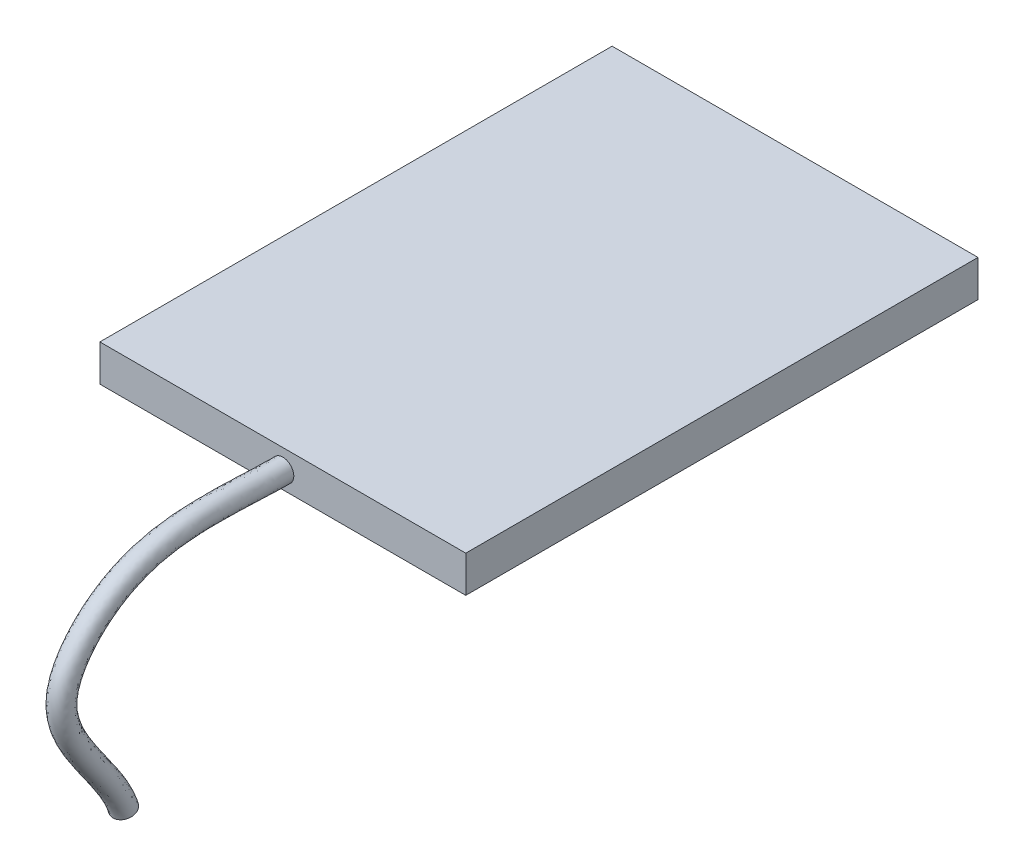
ISO-10303-21;
HEADER;
FILE_DESCRIPTION(('STEP AP214'),'2;1');
FILE_NAME('part.step','',(''),(''),'','','');
FILE_SCHEMA(('AUTOMOTIVE_DESIGN { 1 0 10303 214 1 1 1 1 }'));
ENDSEC;
DATA;
#1=APPLICATION_CONTEXT('core data for automotive mechanical design processes');
#2=APPLICATION_PROTOCOL_DEFINITION('international standard','automotive_design',2000,#1);
#3=PRODUCT_CONTEXT('',#1,'mechanical');
#4=PRODUCT('Part','Part','',(#3));
#5=PRODUCT_RELATED_PRODUCT_CATEGORY('part','',(#4));
#6=PRODUCT_DEFINITION_FORMATION('','',#4);
#7=PRODUCT_DEFINITION_CONTEXT('part definition',#1,'design');
#8=PRODUCT_DEFINITION('design','',#6,#7);
#9=PRODUCT_DEFINITION_SHAPE('','',#8);
#10=(LENGTH_UNIT() NAMED_UNIT(*) SI_UNIT(.MILLI.,.METRE.));
#11=(NAMED_UNIT(*) PLANE_ANGLE_UNIT() SI_UNIT($,.RADIAN.));
#12=(NAMED_UNIT(*) SI_UNIT($,.STERADIAN.) SOLID_ANGLE_UNIT());
#13=UNCERTAINTY_MEASURE_WITH_UNIT(LENGTH_MEASURE(1.E-05),#10,'distance_accuracy_value','');
#14=(GEOMETRIC_REPRESENTATION_CONTEXT(3) GLOBAL_UNCERTAINTY_ASSIGNED_CONTEXT((#13)) GLOBAL_UNIT_ASSIGNED_CONTEXT((#10,
#11,#12)) REPRESENTATION_CONTEXT('',''));
#15=CARTESIAN_POINT('',(0.,0.,0.));
#16=DIRECTION('',(0.,0.,1.));
#17=DIRECTION('',(1.,0.,0.));
#18=AXIS2_PLACEMENT_3D('',#15,#16,#17);
#19=CARTESIAN_POINT('',(-25.,5.,35.));
#20=DIRECTION('',(0.,0.,-1.));
#21=DIRECTION('',(-1.,0.,0.));
#22=AXIS2_PLACEMENT_3D('',#19,#20,#21);
#23=PLANE('',#22);
#24=DIRECTION('',(1.,0.,0.));
#25=VECTOR('',#24,1.);
#26=CARTESIAN_POINT('',(-25.,0.,35.));
#27=LINE('',#26,#25);
#28=CARTESIAN_POINT('',(-25.,0.,35.));
#29=VERTEX_POINT('',#28);
#30=CARTESIAN_POINT('',(25.,0.,35.));
#31=VERTEX_POINT('',#30);
#32=EDGE_CURVE('E93',#29,#31,#27,.T.);
#33=ORIENTED_EDGE('',*,*,#32,.T.);
#34=DIRECTION('',(0.,-1.,0.));
#35=VECTOR('',#34,1.);
#36=CARTESIAN_POINT('',(25.,5.,35.));
#37=LINE('',#36,#35);
#38=CARTESIAN_POINT('',(25.,5.,35.));
#39=VERTEX_POINT('',#38);
#40=EDGE_CURVE('E120',#39,#31,#37,.T.);
#41=ORIENTED_EDGE('',*,*,#40,.F.);
#42=DIRECTION('',(1.,0.,0.));
#43=VECTOR('',#42,1.);
#44=CARTESIAN_POINT('',(-25.,5.,35.));
#45=LINE('',#44,#43);
#46=CARTESIAN_POINT('',(-25.,5.,35.));
#47=VERTEX_POINT('',#46);
#48=EDGE_CURVE('E70',#47,#39,#45,.T.);
#49=ORIENTED_EDGE('',*,*,#48,.F.);
#50=DIRECTION('',(0.,-1.,0.));
#51=VECTOR('',#50,1.);
#52=CARTESIAN_POINT('',(-25.,5.,35.));
#53=LINE('',#52,#51);
#54=EDGE_CURVE('E114',#47,#29,#53,.T.);
#55=ORIENTED_EDGE('',*,*,#54,.T.);
#56=EDGE_LOOP('',(#33,#41,#49,#55));
#57=FACE_BOUND('',#56,.T.);
#58=CARTESIAN_POINT('',(0.,0.862394410773969,35.0025500053475));
#59=CARTESIAN_POINT('',(3.,0.862394410773936,35.0025500053279));
#60=CARTESIAN_POINT('',(3.,3.86239007575262,34.997449994633));
#61=CARTESIAN_POINT('',(0.,3.86239007575266,34.9974499946526));
#62=CARTESIAN_POINT('',(-3.,3.86239007575269,34.9974499946721));
#63=CARTESIAN_POINT('',(-3.,0.862394410774002,35.002550005367));
#64=CARTESIAN_POINT('',(0.,0.862394410773969,35.0025500053475));
#65=(BOUNDED_CURVE() B_SPLINE_CURVE(3,(#58,#59,#60,#61,#62,#63,#64),.UNSPECIFIED.,.T.,
.F.) B_SPLINE_CURVE_WITH_KNOTS((4,3,4),(0.,0.5,1.),
.UNSPECIFIED.) CURVE() GEOMETRIC_REPRESENTATION_ITEM() RATIONAL_B_SPLINE_CURVE((1.,
0.333333333333333,0.333333333333333,1.,0.333333333333333,0.333333333333333,1.)) REPRESENTATION_ITEM(''));
#66=CARTESIAN_POINT('',(0.,0.862394410773969,35.0025500053475));
#67=VERTEX_POINT('',#66);
#68=EDGE_CURVE('E12',#67,#67,#65,.T.);
#69=ORIENTED_EDGE('',*,*,#68,.F.);
#70=EDGE_LOOP('',(#69));
#71=FACE_BOUND('',#70,.T.);
#72=ADVANCED_FACE('F49',(#57,#71),#23,.F.);
#73=CARTESIAN_POINT('',(25.,5.,-35.));
#74=DIRECTION('',(-1.,0.,0.));
#75=DIRECTION('',(0.,0.,1.));
#76=AXIS2_PLACEMENT_3D('',#73,#74,#75);
#77=PLANE('',#76);
#78=DIRECTION('',(0.,0.,-1.));
#79=VECTOR('',#78,1.);
#80=CARTESIAN_POINT('',(25.,0.,-35.));
#81=LINE('',#80,#79);
#82=CARTESIAN_POINT('',(25.,0.,-35.));
#83=VERTEX_POINT('',#82);
#84=EDGE_CURVE('E124',#31,#83,#81,.T.);
#85=ORIENTED_EDGE('',*,*,#84,.T.);
#86=DIRECTION('',(0.,-1.,0.));
#87=VECTOR('',#86,1.);
#88=CARTESIAN_POINT('',(25.,5.,-35.));
#89=LINE('',#88,#87);
#90=CARTESIAN_POINT('',(25.,5.,-35.));
#91=VERTEX_POINT('',#90);
#92=EDGE_CURVE('E62',#91,#83,#89,.T.);
#93=ORIENTED_EDGE('',*,*,#92,.F.);
#94=DIRECTION('',(0.,0.,-1.));
#95=VECTOR('',#94,1.);
#96=CARTESIAN_POINT('',(25.,5.,-35.));
#97=LINE('',#96,#95);
#98=EDGE_CURVE('E106',#39,#91,#97,.T.);
#99=ORIENTED_EDGE('',*,*,#98,.F.);
#100=ORIENTED_EDGE('',*,*,#40,.T.);
#101=EDGE_LOOP('',(#85,#93,#99,#100));
#102=FACE_BOUND('',#101,.T.);
#103=ADVANCED_FACE('F51',(#102),#77,.F.);
#104=CARTESIAN_POINT('',(-25.,5.,-35.));
#105=DIRECTION('',(0.,0.,1.));
#106=DIRECTION('',(1.,0.,0.));
#107=AXIS2_PLACEMENT_3D('',#104,#105,#106);
#108=PLANE('',#107);
#109=DIRECTION('',(-1.,0.,0.));
#110=VECTOR('',#109,1.);
#111=CARTESIAN_POINT('',(-25.,0.,-35.));
#112=LINE('',#111,#110);
#113=CARTESIAN_POINT('',(-25.,0.,-35.));
#114=VERTEX_POINT('',#113);
#115=EDGE_CURVE('E112',#83,#114,#112,.T.);
#116=ORIENTED_EDGE('',*,*,#115,.T.);
#117=DIRECTION('',(0.,-1.,0.));
#118=VECTOR('',#117,1.);
#119=CARTESIAN_POINT('',(-25.,5.,-35.));
#120=LINE('',#119,#118);
#121=CARTESIAN_POINT('',(-25.,5.,-35.));
#122=VERTEX_POINT('',#121);
#123=EDGE_CURVE('E110',#122,#114,#120,.T.);
#124=ORIENTED_EDGE('',*,*,#123,.F.);
#125=DIRECTION('',(-1.,0.,0.));
#126=VECTOR('',#125,1.);
#127=CARTESIAN_POINT('',(-25.,5.,-35.));
#128=LINE('',#127,#126);
#129=EDGE_CURVE('E101',#91,#122,#128,.T.);
#130=ORIENTED_EDGE('',*,*,#129,.F.);
#131=ORIENTED_EDGE('',*,*,#92,.T.);
#132=EDGE_LOOP('',(#116,#124,#130,#131));
#133=FACE_BOUND('',#132,.T.);
#134=ADVANCED_FACE('F111',(#133),#108,.F.);
#135=CARTESIAN_POINT('',(-25.,5.,-35.));
#136=DIRECTION('',(1.,0.,0.));
#137=DIRECTION('',(0.,0.,-1.));
#138=AXIS2_PLACEMENT_3D('',#135,#136,#137);
#139=PLANE('',#138);
#140=DIRECTION('',(0.,0.,1.));
#141=VECTOR('',#140,1.);
#142=CARTESIAN_POINT('',(-25.,0.,-35.));
#143=LINE('',#142,#141);
#144=EDGE_CURVE('E87',#114,#29,#143,.T.);
#145=ORIENTED_EDGE('',*,*,#144,.T.);
#146=ORIENTED_EDGE('',*,*,#54,.F.);
#147=DIRECTION('',(0.,0.,1.));
#148=VECTOR('',#147,1.);
#149=CARTESIAN_POINT('',(-25.,5.,-35.));
#150=LINE('',#149,#148);
#151=EDGE_CURVE('E104',#122,#47,#150,.T.);
#152=ORIENTED_EDGE('',*,*,#151,.F.);
#153=ORIENTED_EDGE('',*,*,#123,.T.);
#154=EDGE_LOOP('',(#145,#146,#152,#153));
#155=FACE_BOUND('',#154,.T.);
#156=ADVANCED_FACE('F116',(#155),#139,.F.);
#157=CARTESIAN_POINT('',(0.,5.,0.));
#158=DIRECTION('',(0.,1.,0.));
#159=DIRECTION('',(0.,0.,1.));
#160=AXIS2_PLACEMENT_3D('',#157,#158,#159);
#161=PLANE('',#160);
#162=ORIENTED_EDGE('',*,*,#98,.T.);
#163=ORIENTED_EDGE('',*,*,#129,.T.);
#164=ORIENTED_EDGE('',*,*,#151,.T.);
#165=ORIENTED_EDGE('',*,*,#48,.T.);
#166=EDGE_LOOP('',(#162,#163,#164,#165));
#167=FACE_BOUND('',#166,.T.);
#168=ADVANCED_FACE('F102',(#167),#161,.T.);
#169=CARTESIAN_POINT('',(0.,0.,0.));
#170=DIRECTION('',(0.,1.,0.));
#171=DIRECTION('',(0.,0.,1.));
#172=AXIS2_PLACEMENT_3D('',#169,#170,#171);
#173=PLANE('',#172);
#174=ORIENTED_EDGE('',*,*,#84,.F.);
#175=ORIENTED_EDGE('',*,*,#32,.F.);
#176=ORIENTED_EDGE('',*,*,#144,.F.);
#177=ORIENTED_EDGE('',*,*,#115,.F.);
#178=EDGE_LOOP('',(#174,#175,#176,#177));
#179=FACE_BOUND('',#178,.T.);
#180=ADVANCED_FACE('F162',(#179),#173,.F.);
#181=CARTESIAN_POINT('',(-1.13686837721616E-10,-26.7956207276967,56.7662185084004));
#182=DIRECTION('',(5.5650870835715E-13,-0.954485346887866,-0.298257812263736));
#183=DIRECTION('',(-1.68238484214584E-10,0.298257812263736,-0.954485346887866));
#184=AXIS2_PLACEMENT_3D('',#181,#182,#183);
#185=PLANE('',#184);
#186=CARTESIAN_POINT('',(-1.13686837721616E-10,-26.7956207276967,56.7662185084004));
#187=DIRECTION('',(5.5650870835715E-13,-0.954485346887866,-0.298257812263736));
#188=DIRECTION('',(-1.68238484214584E-10,0.298257812263736,-0.954485346887866));
#189=AXIS2_PLACEMENT_3D('',#186,#187,#188);
#190=CIRCLE('',#189,1.5);
#191=CARTESIAN_POINT('',(-3.66044564043492E-10,-26.3482340093011,55.3344904880686));
#192=VERTEX_POINT('',#191);
#193=EDGE_CURVE('E128',#192,#192,#190,.T.);
#194=ORIENTED_EDGE('',*,*,#193,.T.);
#195=EDGE_LOOP('',(#194));
#196=FACE_BOUND('',#195,.T.);
#197=ADVANCED_FACE('F160',(#196),#185,.T.);
#198=CARTESIAN_POINT('',(0.,0.862394410773969,35.0025500053475));
#199=CARTESIAN_POINT('',(2.64381526194862E-11,0.869298651542284,39.0638507631285));
#200=CARTESIAN_POINT('',(5.59460359828133E-12,1.26059778120762,43.218623771391));
#201=CARTESIAN_POINT('',(-6.08185929465091E-11,0.877531477641753,51.0940830428626));
#202=CARTESIAN_POINT('',(-1.09523598211197E-10,0.125863650141136,54.7691872850599));
#203=CARTESIAN_POINT('',(-1.68810123195719E-10,-3.01628952757428,59.4937415169458));
#204=CARTESIAN_POINT('',(-1.82759800070933E-10,-4.2853463699794,60.8850061238765));
#205=CARTESIAN_POINT('',(-2.21395111713125E-10,-7.0103042031876,62.9444114294657));
#206=CARTESIAN_POINT('',(-2.4771077240199E-10,-8.45401761565925,63.5960388533228));
#207=CARTESIAN_POINT('',(-3.32211094054773E-10,-10.8884346557898,63.8330835144907));
#208=CARTESIAN_POINT('',(-3.6348652100809E-10,-12.0937571926947,63.567187854217));
#209=CARTESIAN_POINT('',(-4.00261228614887E-10,-14.7048917483991,62.4371316927284));
#210=CARTESIAN_POINT('',(-4.090450553345E-10,-16.0841415799261,61.5768536634033));
#211=CARTESIAN_POINT('',(-4.17737455253821E-10,-18.8956411234673,59.6511044042016));
#212=CARTESIAN_POINT('',(-4.17604573970751E-10,-20.3280448853732,58.5889439725296));
#213=CARTESIAN_POINT('',(-4.05378082484648E-10,-23.2570324861311,56.6837695331684));
#214=CARTESIAN_POINT('',(-3.93360682968473E-10,-24.7534320385055,55.8328346067916));
#215=CARTESIAN_POINT('',(-3.66044564043492E-10,-26.3482340093011,55.3344904880686));
#216=CARTESIAN_POINT('',(3.,0.862394410773936,35.0025500053279));
#217=CARTESIAN_POINT('',(3.00000000002644,0.869298651542144,39.0638507631364));
#218=CARTESIAN_POINT('',(3.0000000000056,1.26059778121126,43.2186237714139));
#219=CARTESIAN_POINT('',(2.99999999993918,0.877531477632976,51.0940830428855));
#220=CARTESIAN_POINT('',(2.99999999989048,0.125863650100272,54.7691872850794));
#221=CARTESIAN_POINT('',(2.99999999983119,-3.01628952765275,59.49374151689));
#222=CARTESIAN_POINT('',(2.99999999981724,-4.28534637006898,60.8850061237871));
#223=CARTESIAN_POINT('',(2.99999999977861,-7.0103042032937,62.9444114292904));
#224=CARTESIAN_POINT('',(2.99999999975229,-8.4540176157661,63.5960388530651));
#225=CARTESIAN_POINT('',(2.99999999966779,-10.8884346557545,63.8330835140471));
#226=CARTESIAN_POINT('',(2.99999999963651,-12.0937571925486,63.5671878537261));
#227=CARTESIAN_POINT('',(2.99999999959974,-14.7048917481153,62.4371316922265));
#228=CARTESIAN_POINT('',(2.99999999959096,-16.084141579605,61.5768536629061));
#229=CARTESIAN_POINT('',(2.99999999958226,-18.8956411231099,59.6511044037045));
#230=CARTESIAN_POINT('',(2.9999999995824,-20.3280448850217,58.5889439720307));
#231=CARTESIAN_POINT('',(2.99999999959462,-23.2570324858351,56.6837695326696));
#232=CARTESIAN_POINT('',(2.99999999960664,-24.7534320382807,55.8328346062777));
#233=CARTESIAN_POINT('',(2.99999999963396,-26.348234009149,55.3344904875873));
#234=CARTESIAN_POINT('',(3.,3.86239007575262,34.997449994633));
#235=CARTESIAN_POINT('',(3.00000000002516,3.86895996595442,38.86207508769));
#236=CARTESIAN_POINT('',(3.00000000000331,4.27130173114763,43.0714789476952));
#237=CARTESIAN_POINT('',(2.99999999994438,3.85974240166719,51.5327262599825));
#238=CARTESIAN_POINT('',(2.99999999991044,3.02314370779798,55.8301517428291));
#239=CARTESIAN_POINT('',(2.99999999992886,-0.69570916201396,61.4218339661043));
#240=CARTESIAN_POINT('',(2.99999999994097,-2.16157157692055,63.0403365177642));
#241=CARTESIAN_POINT('',(2.99999999998405,-5.51646737589462,65.5758216970664));
#242=CARTESIAN_POINT('',(3.00000000001665,-7.41768835421433,66.5093176246261));
#243=CARTESIAN_POINT('',(3.00000000010809,-11.2563570560723,66.8830974237331));
#244=CARTESIAN_POINT('',(3.0000000001406,-12.9823123796716,66.4515368937972));
#245=CARTESIAN_POINT('',(3.00000000017759,-16.199432328497,65.0592202085888));
#246=CARTESIAN_POINT('',(3.00000000018536,-17.7171591432804,64.0945815512287));
#247=CARTESIAN_POINT('',(3.00000000019162,-20.6532350666905,62.0835031407182));
#248=CARTESIAN_POINT('',(3.00000000019007,-22.0714301258608,61.0337525573335));
#249=CARTESIAN_POINT('',(3.00000000017641,-24.7851857287724,59.2685768322201));
#250=CARTESIAN_POINT('',(3.00000000016438,-26.0809305591077,58.5610725970859));
#251=CARTESIAN_POINT('',(3.00000000013867,-27.2430074459402,58.1979465282509));
#252=CARTESIAN_POINT('',(0.,3.86239007575266,34.9974499946526));
#253=CARTESIAN_POINT('',(2.51580221471635E-11,3.86895996595488,38.8620750876821));
#254=CARTESIAN_POINT('',(3.30535741433879E-12,4.27130173114311,43.0714789476794));
#255=CARTESIAN_POINT('',(-5.56190742247205E-11,3.85974240167686,51.5327262599525));
#256=CARTESIAN_POINT('',(-8.95554836917697E-11,3.02314370784256,55.8301517428022));
#257=CARTESIAN_POINT('',(-7.11351045915271E-11,-0.695709161937137,61.4218339661634));
#258=CARTESIAN_POINT('',(-5.90280254403821E-11,-2.16157157682932,63.0403365178502));
#259=CARTESIAN_POINT('',(-1.59494437069279E-11,-5.51646737579016,65.575821697245));
#260=CARTESIAN_POINT('',(1.66520851051667E-11,-7.41768835410167,66.5093176248838));
#261=CARTESIAN_POINT('',(1.08093163447032E-10,-11.2563570561128,66.8830974241767));
#262=CARTESIAN_POINT('',(1.405945243175E-10,-12.9823123798204,66.4515368942826));
#263=CARTESIAN_POINT('',(1.77585450675773E-10,-16.199432328778,65.0592202090962));
#264=CARTESIAN_POINT('',(1.85359562196459E-10,-17.717159143603,64.0945815517258));
#265=CARTESIAN_POINT('',(1.91620488182377E-10,-20.6532350670464,62.0835031412154));
#266=CARTESIAN_POINT('',(1.90065848094955E-10,-22.0714301262138,61.0337525578295));
#267=CARTESIAN_POINT('',(1.76407400929708E-10,-24.7851857290669,59.268576832722));
#268=CARTESIAN_POINT('',(1.64379804512975E-10,-26.080930559345,58.5610725975897));
#269=CARTESIAN_POINT('',(1.3867107229728E-10,-27.2430074460923,58.1979465287322));
#270=CARTESIAN_POINT('',(-3.,3.86239007575269,34.9974499946721));
#271=CARTESIAN_POINT('',(-2.99999999997484,3.86895996595535,38.8620750876741));
#272=CARTESIAN_POINT('',(-2.9999999999967,4.27130173113858,43.0714789476636));
#273=CARTESIAN_POINT('',(-3.00000000005562,3.85974240168652,51.5327262599225));
#274=CARTESIAN_POINT('',(-3.00000000008956,3.02314370788715,55.8301517427753));
#275=CARTESIAN_POINT('',(-3.00000000007114,-0.695709161860311,61.4218339662224));
#276=CARTESIAN_POINT('',(-3.00000000005903,-2.16157157673808,63.0403365179363));
#277=CARTESIAN_POINT('',(-3.00000000001595,-5.51646737568571,65.5758216974236));
#278=CARTESIAN_POINT('',(-2.99999999998335,-7.41768835398901,66.5093176251415));
#279=CARTESIAN_POINT('',(-2.99999999989191,-11.2563570561532,66.8830974246203));
#280=CARTESIAN_POINT('',(-2.99999999985941,-12.9823123799693,66.451536894768));
#281=CARTESIAN_POINT('',(-2.99999999982241,-16.1994323290591,65.0592202096037));
#282=CARTESIAN_POINT('',(-2.99999999981464,-17.7171591439257,64.094581552223));
#283=CARTESIAN_POINT('',(-2.99999999980838,-20.6532350674023,62.0835031417125));
#284=CARTESIAN_POINT('',(-2.99999999980994,-22.0714301265667,61.0337525583255));
#285=CARTESIAN_POINT('',(-2.99999999982359,-24.7851857293615,59.2685768332238));
#286=CARTESIAN_POINT('',(-2.99999999983562,-26.0809305595823,58.5610725980935));
#287=CARTESIAN_POINT('',(-2.99999999986133,-27.2430074462444,58.1979465292134));
#288=CARTESIAN_POINT('',(-3.,0.862394410774002,35.002550005367));
#289=CARTESIAN_POINT('',(-2.99999999997356,0.869298651542425,39.0638507631205));
#290=CARTESIAN_POINT('',(-2.99999999999441,1.26059778120398,43.2186237713681));
#291=CARTESIAN_POINT('',(-3.00000000006082,0.87753147765053,51.0940830428397));
#292=CARTESIAN_POINT('',(-3.00000000010952,0.125863650181999,54.7691872850404));
#293=CARTESIAN_POINT('',(-3.00000000016881,-3.0162895274958,59.4937415170015));
#294=CARTESIAN_POINT('',(-3.00000000018276,-4.28534636988981,60.8850061239659));
#295=CARTESIAN_POINT('',(-3.0000000002214,-7.01030420308149,62.944411429641));
#296=CARTESIAN_POINT('',(-3.00000000024771,-8.45401761555239,63.5960388535805));
#297=CARTESIAN_POINT('',(-3.00000000033221,-10.8884346558251,63.8330835149343));
#298=CARTESIAN_POINT('',(-3.00000000036349,-12.0937571928408,63.5671878547079));
#299=CARTESIAN_POINT('',(-3.00000000040026,-14.7048917486829,62.4371316932303));
#300=CARTESIAN_POINT('',(-3.00000000040905,-16.0841415802473,61.5768536639005));
#301=CARTESIAN_POINT('',(-3.00000000041774,-18.8956411238247,59.6511044046988));
#302=CARTESIAN_POINT('',(-3.00000000041761,-20.3280448857247,58.5889439730285));
#303=CARTESIAN_POINT('',(-3.00000000040538,-23.2570324864271,56.6837695336673));
#304=CARTESIAN_POINT('',(-3.00000000039336,-24.7534320387303,55.8328346073054));
#305=CARTESIAN_POINT('',(-3.00000000036605,-26.3482340094532,55.3344904885498));
#306=CARTESIAN_POINT('',(0.,0.862394410773969,35.0025500053475));
#307=CARTESIAN_POINT('',(2.64381526194862E-11,0.869298651542284,39.0638507631285));
#308=CARTESIAN_POINT('',(5.59460359828133E-12,1.26059778120762,43.218623771391));
#309=CARTESIAN_POINT('',(-6.08185929465091E-11,0.877531477641753,51.0940830428626));
#310=CARTESIAN_POINT('',(-1.09523598211197E-10,0.125863650141136,54.7691872850599));
#311=CARTESIAN_POINT('',(-1.68810123195719E-10,-3.01628952757428,59.4937415169458));
#312=CARTESIAN_POINT('',(-1.82759800070933E-10,-4.2853463699794,60.8850061238765));
#313=CARTESIAN_POINT('',(-2.21395111713125E-10,-7.0103042031876,62.9444114294657));
#314=CARTESIAN_POINT('',(-2.4771077240199E-10,-8.45401761565925,63.5960388533228));
#315=CARTESIAN_POINT('',(-3.32211094054773E-10,-10.8884346557898,63.8330835144907));
#316=CARTESIAN_POINT('',(-3.6348652100809E-10,-12.0937571926947,63.567187854217));
#317=CARTESIAN_POINT('',(-4.00261228614887E-10,-14.7048917483991,62.4371316927284));
#318=CARTESIAN_POINT('',(-4.090450553345E-10,-16.0841415799261,61.5768536634033));
#319=CARTESIAN_POINT('',(-4.17737455253821E-10,-18.8956411234673,59.6511044042016));
#320=CARTESIAN_POINT('',(-4.17604573970751E-10,-20.3280448853732,58.5889439725296));
#321=CARTESIAN_POINT('',(-4.05378082484648E-10,-23.2570324861311,56.6837695331684));
#322=CARTESIAN_POINT('',(-3.93360682968473E-10,-24.7534320385055,55.8328346067916));
#323=CARTESIAN_POINT('',(-3.66044564043492E-10,-26.3482340093011,55.3344904880686));
#324=(BOUNDED_SURFACE() B_SPLINE_SURFACE(3,3,((#198,#199,#200,#201,#202,#203,#204,#205,#206,
#207,#208,#209,#210,#211,#212,#213,#214,#215),(#216,#217,#218,#219,#220,#221,#222,#223,#224,
#225,#226,#227,#228,#229,#230,#231,#232,#233),(#234,#235,#236,#237,#238,#239,#240,#241,#242,
#243,#244,#245,#246,#247,#248,#249,#250,#251),(#252,#253,#254,#255,#256,#257,#258,#259,#260,
#261,#262,#263,#264,#265,#266,#267,#268,#269),(#270,#271,#272,#273,#274,#275,#276,#277,#278,
#279,#280,#281,#282,#283,#284,#285,#286,#287),(#288,#289,#290,#291,#292,#293,#294,#295,#296,
#297,#298,#299,#300,#301,#302,#303,#304,#305),(#306,#307,#308,#309,#310,#311,#312,#313,#314,
#315,#316,#317,#318,#319,#320,#321,#322,#323)),.UNSPECIFIED.,.T.,.F.,
.F.) B_SPLINE_SURFACE_WITH_KNOTS((4,3,4),(4,2,2,2,2,2,2,2,4),(0.,0.5,1.),(0.,0.224280080389267,
0.448560160778534,0.548211999623613,0.647863838468692,0.735897878851519,0.823931919234346,
0.911965959617173,1.),
.UNSPECIFIED.) GEOMETRIC_REPRESENTATION_ITEM() RATIONAL_B_SPLINE_SURFACE(((1.,1.,1.,1.,1.,1.,1.,
1.,1.,1.,1.,1.,1.,1.,1.,1.,1.,1.),(0.333333333333333,0.333333333333333,0.333333333333333,
0.333333333333333,0.333333333333333,0.333333333333333,0.333333333333333,0.333333333333333,
0.333333333333333,0.333333333333333,0.333333333333333,0.333333333333333,0.333333333333333,
0.333333333333333,0.333333333333333,0.333333333333333,0.333333333333333,0.333333333333333),
(0.333333333333333,0.333333333333333,0.333333333333333,0.333333333333333,0.333333333333333,
0.333333333333333,0.333333333333333,0.333333333333333,0.333333333333333,0.333333333333333,
0.333333333333333,0.333333333333333,0.333333333333333,0.333333333333333,0.333333333333333,
0.333333333333333,0.333333333333333,0.333333333333333),(1.,1.,1.,1.,1.,1.,1.,1.,1.,1.,1.,1.,1.,
1.,1.,1.,1.,1.),(0.333333333333333,0.333333333333333,0.333333333333333,0.333333333333333,
0.333333333333333,0.333333333333333,0.333333333333333,0.333333333333333,0.333333333333333,
0.333333333333333,0.333333333333333,0.333333333333333,0.333333333333333,0.333333333333333,
0.333333333333333,0.333333333333333,0.333333333333333,0.333333333333333),(0.333333333333333,
0.333333333333333,0.333333333333333,0.333333333333333,0.333333333333333,0.333333333333333,
0.333333333333333,0.333333333333333,0.333333333333333,0.333333333333333,0.333333333333333,
0.333333333333333,0.333333333333333,0.333333333333333,0.333333333333333,0.333333333333333,
0.333333333333333,0.333333333333333),(1.,1.,1.,1.,1.,1.,1.,1.,1.,1.,1.,1.,1.,1.,1.,1.,1.,1.))) REPRESENTATION_ITEM('') SURFACE());
#325=ORIENTED_EDGE('',*,*,#193,.F.);
#326=EDGE_LOOP('',(#325));
#327=FACE_BOUND('',#326,.T.);
#328=ORIENTED_EDGE('',*,*,#68,.T.);
#329=EDGE_LOOP('',(#328));
#330=FACE_BOUND('',#329,.T.);
#331=ADVANCED_FACE('F144',(#327,#330),#324,.T.);
#332=CLOSED_SHELL('',(#72,#103,#134,#156,#168,#180,#197,#331));
#333=MANIFOLD_SOLID_BREP('B2',#332);
#334=ADVANCED_BREP_SHAPE_REPRESENTATION('',(#18,#333),#14);
#335=SHAPE_DEFINITION_REPRESENTATION(#9,#334);
ENDSEC;
END-ISO-10303-21;
